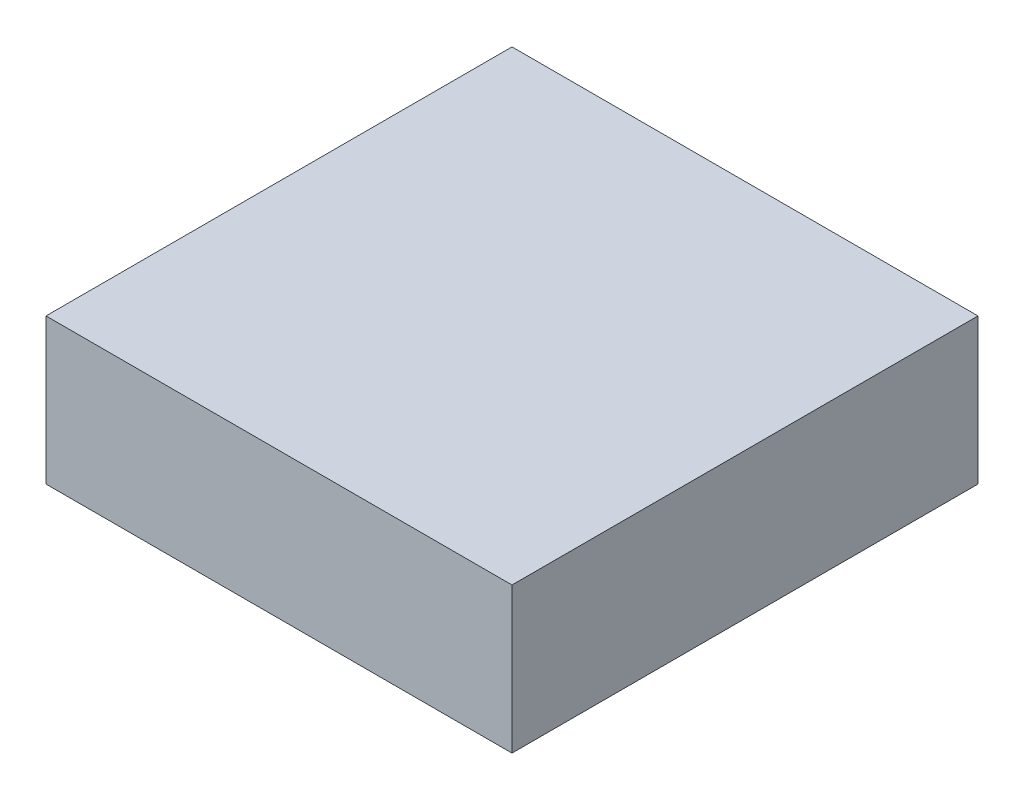
ISO-10303-21;
HEADER;
FILE_DESCRIPTION(('STEP AP214'),'2;1');
FILE_NAME('part.step','',(''),(''),'','','');
FILE_SCHEMA(('AUTOMOTIVE_DESIGN { 1 0 10303 214 1 1 1 1 }'));
ENDSEC;
DATA;
#1=APPLICATION_CONTEXT('core data for automotive mechanical design processes');
#2=APPLICATION_PROTOCOL_DEFINITION('international standard','automotive_design',2000,#1);
#3=PRODUCT_CONTEXT('',#1,'mechanical');
#4=PRODUCT('Part','Part','',(#3));
#5=PRODUCT_RELATED_PRODUCT_CATEGORY('part','',(#4));
#6=PRODUCT_DEFINITION_FORMATION('','',#4);
#7=PRODUCT_DEFINITION_CONTEXT('part definition',#1,'design');
#8=PRODUCT_DEFINITION('design','',#6,#7);
#9=PRODUCT_DEFINITION_SHAPE('','',#8);
#10=(LENGTH_UNIT() NAMED_UNIT(*) SI_UNIT(.MILLI.,.METRE.));
#11=(NAMED_UNIT(*) PLANE_ANGLE_UNIT() SI_UNIT($,.RADIAN.));
#12=(NAMED_UNIT(*) SI_UNIT($,.STERADIAN.) SOLID_ANGLE_UNIT());
#13=UNCERTAINTY_MEASURE_WITH_UNIT(LENGTH_MEASURE(1.E-05),#10,'distance_accuracy_value','');
#14=(GEOMETRIC_REPRESENTATION_CONTEXT(3) GLOBAL_UNCERTAINTY_ASSIGNED_CONTEXT((#13)) GLOBAL_UNIT_ASSIGNED_CONTEXT((#10,
#11,#12)) REPRESENTATION_CONTEXT('',''));
#15=CARTESIAN_POINT('',(0.,0.,0.));
#16=DIRECTION('',(0.,0.,1.));
#17=DIRECTION('',(1.,0.,0.));
#18=AXIS2_PLACEMENT_3D('',#15,#16,#17);
#19=CARTESIAN_POINT('',(0.8,0.5,0.8));
#20=DIRECTION('',(-1.,0.,0.));
#21=DIRECTION('',(0.,0.,1.));
#22=AXIS2_PLACEMENT_3D('',#19,#20,#21);
#23=PLANE('',#22);
#24=DIRECTION('',(0.,0.,-1.));
#25=VECTOR('',#24,1.);
#26=CARTESIAN_POINT('',(0.8,0.,0.8));
#27=LINE('',#26,#25);
#28=CARTESIAN_POINT('',(0.8,0.,0.8));
#29=VERTEX_POINT('',#28);
#30=CARTESIAN_POINT('',(0.8,0.,-0.8));
#31=VERTEX_POINT('',#30);
#32=EDGE_CURVE('E100',#29,#31,#27,.T.);
#33=ORIENTED_EDGE('',*,*,#32,.T.);
#34=DIRECTION('',(0.,-1.,0.));
#35=VECTOR('',#34,1.);
#36=CARTESIAN_POINT('',(0.8,0.5,-0.8));
#37=LINE('',#36,#35);
#38=CARTESIAN_POINT('',(0.8,0.5,-0.8));
#39=VERTEX_POINT('',#38);
#40=EDGE_CURVE('E11',#39,#31,#37,.T.);
#41=ORIENTED_EDGE('',*,*,#40,.F.);
#42=DIRECTION('',(0.,0.,-1.));
#43=VECTOR('',#42,1.);
#44=CARTESIAN_POINT('',(0.8,0.5,0.8));
#45=LINE('',#44,#43);
#46=CARTESIAN_POINT('',(0.8,0.5,0.8));
#47=VERTEX_POINT('',#46);
#48=EDGE_CURVE('E88',#47,#39,#45,.T.);
#49=ORIENTED_EDGE('',*,*,#48,.F.);
#50=DIRECTION('',(0.,-1.,0.));
#51=VECTOR('',#50,1.);
#52=CARTESIAN_POINT('',(0.8,0.5,0.8));
#53=LINE('',#52,#51);
#54=EDGE_CURVE('E96',#47,#29,#53,.T.);
#55=ORIENTED_EDGE('',*,*,#54,.T.);
#56=EDGE_LOOP('',(#33,#41,#49,#55));
#57=FACE_BOUND('',#56,.T.);
#58=ADVANCED_FACE('F37',(#57),#23,.F.);
#59=CARTESIAN_POINT('',(-0.8,0.5,-0.8));
#60=DIRECTION('',(0.,0.,1.));
#61=DIRECTION('',(1.,0.,0.));
#62=AXIS2_PLACEMENT_3D('',#59,#60,#61);
#63=PLANE('',#62);
#64=DIRECTION('',(-1.,0.,0.));
#65=VECTOR('',#64,1.);
#66=CARTESIAN_POINT('',(-0.8,0.,-0.8));
#67=LINE('',#66,#65);
#68=CARTESIAN_POINT('',(-0.8,0.,-0.8));
#69=VERTEX_POINT('',#68);
#70=EDGE_CURVE('E92',#31,#69,#67,.T.);
#71=ORIENTED_EDGE('',*,*,#70,.T.);
#72=DIRECTION('',(0.,-1.,0.));
#73=VECTOR('',#72,1.);
#74=CARTESIAN_POINT('',(-0.8,0.5,-0.8));
#75=LINE('',#74,#73);
#76=CARTESIAN_POINT('',(-0.8,0.5,-0.8));
#77=VERTEX_POINT('',#76);
#78=EDGE_CURVE('E45',#77,#69,#75,.T.);
#79=ORIENTED_EDGE('',*,*,#78,.F.);
#80=DIRECTION('',(-1.,0.,0.));
#81=VECTOR('',#80,1.);
#82=CARTESIAN_POINT('',(-0.8,0.5,-0.8));
#83=LINE('',#82,#81);
#84=EDGE_CURVE('E83',#39,#77,#83,.T.);
#85=ORIENTED_EDGE('',*,*,#84,.F.);
#86=ORIENTED_EDGE('',*,*,#40,.T.);
#87=EDGE_LOOP('',(#71,#79,#85,#86));
#88=FACE_BOUND('',#87,.T.);
#89=ADVANCED_FACE('F91',(#88),#63,.F.);
#90=CARTESIAN_POINT('',(-0.8,0.5,0.8));
#91=DIRECTION('',(1.,0.,0.));
#92=DIRECTION('',(0.,0.,-1.));
#93=AXIS2_PLACEMENT_3D('',#90,#91,#92);
#94=PLANE('',#93);
#95=DIRECTION('',(0.,0.,1.));
#96=VECTOR('',#95,1.);
#97=CARTESIAN_POINT('',(-0.8,0.,0.8));
#98=LINE('',#97,#96);
#99=CARTESIAN_POINT('',(-0.8,0.,0.8));
#100=VERTEX_POINT('',#99);
#101=EDGE_CURVE('E70',#69,#100,#98,.T.);
#102=ORIENTED_EDGE('',*,*,#101,.T.);
#103=DIRECTION('',(0.,-1.,0.));
#104=VECTOR('',#103,1.);
#105=CARTESIAN_POINT('',(-0.8,0.5,0.8));
#106=LINE('',#105,#104);
#107=CARTESIAN_POINT('',(-0.8,0.5,0.8));
#108=VERTEX_POINT('',#107);
#109=EDGE_CURVE('E93',#108,#100,#106,.T.);
#110=ORIENTED_EDGE('',*,*,#109,.F.);
#111=DIRECTION('',(0.,0.,1.));
#112=VECTOR('',#111,1.);
#113=CARTESIAN_POINT('',(-0.8,0.5,0.8));
#114=LINE('',#113,#112);
#115=EDGE_CURVE('E86',#77,#108,#114,.T.);
#116=ORIENTED_EDGE('',*,*,#115,.F.);
#117=ORIENTED_EDGE('',*,*,#78,.T.);
#118=EDGE_LOOP('',(#102,#110,#116,#117));
#119=FACE_BOUND('',#118,.T.);
#120=ADVANCED_FACE('F94',(#119),#94,.F.);
#121=CARTESIAN_POINT('',(-0.8,0.5,0.8));
#122=DIRECTION('',(0.,0.,-1.));
#123=DIRECTION('',(-1.,0.,0.));
#124=AXIS2_PLACEMENT_3D('',#121,#122,#123);
#125=PLANE('',#124);
#126=DIRECTION('',(1.,0.,0.));
#127=VECTOR('',#126,1.);
#128=CARTESIAN_POINT('',(-0.8,0.,0.8));
#129=LINE('',#128,#127);
#130=EDGE_CURVE('E76',#100,#29,#129,.T.);
#131=ORIENTED_EDGE('',*,*,#130,.T.);
#132=ORIENTED_EDGE('',*,*,#54,.F.);
#133=DIRECTION('',(1.,0.,0.));
#134=VECTOR('',#133,1.);
#135=CARTESIAN_POINT('',(-0.8,0.5,0.8));
#136=LINE('',#135,#134);
#137=EDGE_CURVE('E53',#108,#47,#136,.T.);
#138=ORIENTED_EDGE('',*,*,#137,.F.);
#139=ORIENTED_EDGE('',*,*,#109,.T.);
#140=EDGE_LOOP('',(#131,#132,#138,#139));
#141=FACE_BOUND('',#140,.T.);
#142=ADVANCED_FACE('F107',(#141),#125,.F.);
#143=CARTESIAN_POINT('',(0.,0.5,0.));
#144=DIRECTION('',(0.,-1.,0.));
#145=DIRECTION('',(0.,0.,-1.));
#146=AXIS2_PLACEMENT_3D('',#143,#144,#145);
#147=PLANE('',#146);
#148=ORIENTED_EDGE('',*,*,#48,.T.);
#149=ORIENTED_EDGE('',*,*,#84,.T.);
#150=ORIENTED_EDGE('',*,*,#115,.T.);
#151=ORIENTED_EDGE('',*,*,#137,.T.);
#152=EDGE_LOOP('',(#148,#149,#150,#151));
#153=FACE_BOUND('',#152,.T.);
#154=ADVANCED_FACE('F84',(#153),#147,.F.);
#155=CARTESIAN_POINT('',(0.,0.,0.));
#156=DIRECTION('',(0.,-1.,0.));
#157=DIRECTION('',(0.,0.,-1.));
#158=AXIS2_PLACEMENT_3D('',#155,#156,#157);
#159=PLANE('',#158);
#160=ORIENTED_EDGE('',*,*,#32,.F.);
#161=ORIENTED_EDGE('',*,*,#130,.F.);
#162=ORIENTED_EDGE('',*,*,#101,.F.);
#163=ORIENTED_EDGE('',*,*,#70,.F.);
#164=EDGE_LOOP('',(#160,#161,#162,#163));
#165=FACE_BOUND('',#164,.T.);
#166=ADVANCED_FACE('F110',(#165),#159,.T.);
#167=CLOSED_SHELL('',(#58,#89,#120,#142,#154,#166));
#168=MANIFOLD_SOLID_BREP('B2',#167);
#169=ADVANCED_BREP_SHAPE_REPRESENTATION('',(#18,#168),#14);
#170=SHAPE_DEFINITION_REPRESENTATION(#9,#169);
ENDSEC;
END-ISO-10303-21;
